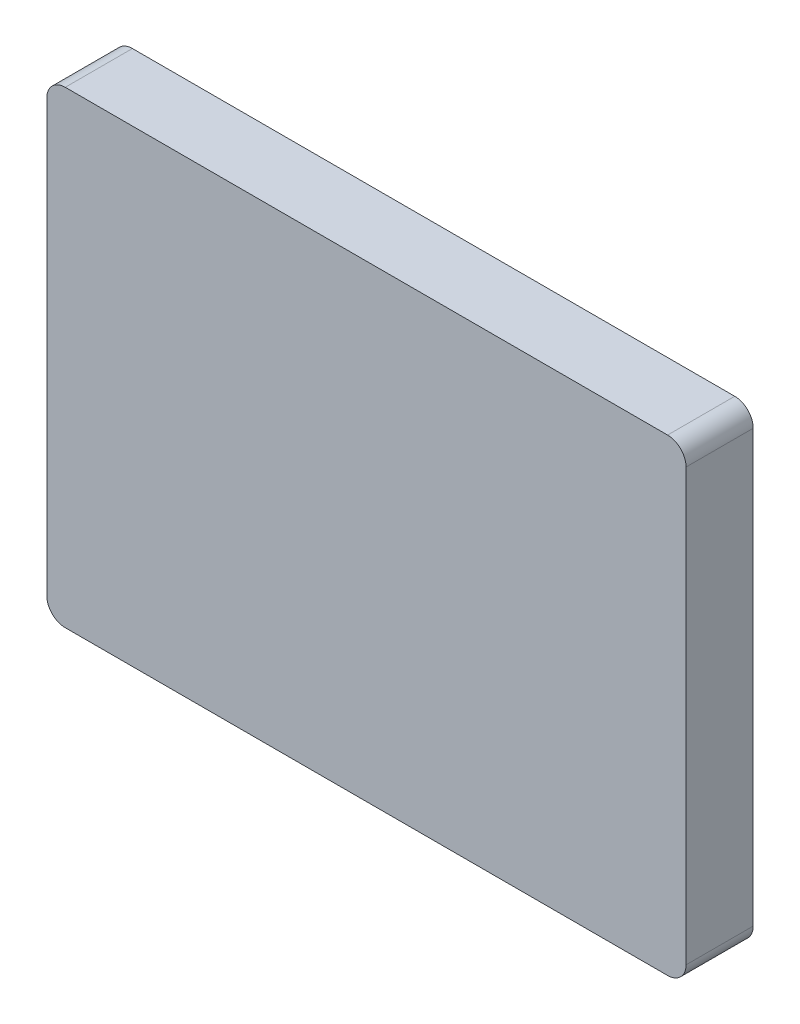
ISO-10303-21;
HEADER;
FILE_DESCRIPTION(('STEP AP214'),'2;1');
FILE_NAME('part.step','',(''),(''),'','','');
FILE_SCHEMA(('AUTOMOTIVE_DESIGN { 1 0 10303 214 1 1 1 1 }'));
ENDSEC;
DATA;
#1=APPLICATION_CONTEXT('core data for automotive mechanical design processes');
#2=APPLICATION_PROTOCOL_DEFINITION('international standard','automotive_design',2000,#1);
#3=PRODUCT_CONTEXT('',#1,'mechanical');
#4=PRODUCT('Part','Part','',(#3));
#5=PRODUCT_RELATED_PRODUCT_CATEGORY('part','',(#4));
#6=PRODUCT_DEFINITION_FORMATION('','',#4);
#7=PRODUCT_DEFINITION_CONTEXT('part definition',#1,'design');
#8=PRODUCT_DEFINITION('design','',#6,#7);
#9=PRODUCT_DEFINITION_SHAPE('','',#8);
#10=(LENGTH_UNIT() NAMED_UNIT(*) SI_UNIT(.MILLI.,.METRE.));
#11=(NAMED_UNIT(*) PLANE_ANGLE_UNIT() SI_UNIT($,.RADIAN.));
#12=(NAMED_UNIT(*) SI_UNIT($,.STERADIAN.) SOLID_ANGLE_UNIT());
#13=UNCERTAINTY_MEASURE_WITH_UNIT(LENGTH_MEASURE(1.E-05),#10,'distance_accuracy_value','');
#14=(GEOMETRIC_REPRESENTATION_CONTEXT(3) GLOBAL_UNCERTAINTY_ASSIGNED_CONTEXT((#13)) GLOBAL_UNIT_ASSIGNED_CONTEXT((#10,
#11,#12)) REPRESENTATION_CONTEXT('',''));
#15=CARTESIAN_POINT('',(0.,0.,0.));
#16=DIRECTION('',(0.,0.,1.));
#17=DIRECTION('',(1.,0.,0.));
#18=AXIS2_PLACEMENT_3D('',#15,#16,#17);
#19=CARTESIAN_POINT('',(44.85,32.2765542250174,10.));
#20=DIRECTION('',(0.,0.,-1.));
#21=DIRECTION('',(-1.,0.,0.));
#22=AXIS2_PLACEMENT_3D('',#19,#20,#21);
#23=CYLINDRICAL_SURFACE('',#22,2.74999999997698);
#24=CARTESIAN_POINT('',(44.85,32.2765542250174,0.));
#25=DIRECTION('',(0.,0.,1.));
#26=DIRECTION('',(1.,0.,0.));
#27=AXIS2_PLACEMENT_3D('',#24,#25,#26);
#28=CIRCLE('',#27,2.74999999997698);
#29=CARTESIAN_POINT('',(47.599999999977,32.2765542250174,0.));
#30=VERTEX_POINT('',#29);
#31=CARTESIAN_POINT('',(44.85,35.0265542249944,0.));
#32=VERTEX_POINT('',#31);
#33=EDGE_CURVE('E146',#30,#32,#28,.T.);
#34=ORIENTED_EDGE('',*,*,#33,.T.);
#35=DIRECTION('',(0.,0.,-1.));
#36=VECTOR('',#35,1.);
#37=CARTESIAN_POINT('',(44.85,35.0265542249944,10.));
#38=LINE('',#37,#36);
#39=CARTESIAN_POINT('',(44.85,35.0265542249944,10.));
#40=VERTEX_POINT('',#39);
#41=EDGE_CURVE('E11',#40,#32,#38,.T.);
#42=ORIENTED_EDGE('',*,*,#41,.F.);
#43=CARTESIAN_POINT('',(44.85,32.2765542250174,10.));
#44=DIRECTION('',(0.,0.,1.));
#45=DIRECTION('',(1.,0.,0.));
#46=AXIS2_PLACEMENT_3D('',#43,#44,#45);
#47=CIRCLE('',#46,2.74999999997698);
#48=CARTESIAN_POINT('',(47.599999999977,32.2765542250174,10.));
#49=VERTEX_POINT('',#48);
#50=EDGE_CURVE('E168',#49,#40,#47,.T.);
#51=ORIENTED_EDGE('',*,*,#50,.F.);
#52=DIRECTION('',(0.,0.,-1.));
#53=VECTOR('',#52,1.);
#54=CARTESIAN_POINT('',(47.599999999977,32.2765542250174,10.));
#55=LINE('',#54,#53);
#56=EDGE_CURVE('E142',#49,#30,#55,.T.);
#57=ORIENTED_EDGE('',*,*,#56,.T.);
#58=EDGE_LOOP('',(#34,#42,#51,#57));
#59=FACE_BOUND('',#58,.T.);
#60=ADVANCED_FACE('F45',(#59),#23,.T.);
#61=CARTESIAN_POINT('',(44.85,35.0265542249944,10.));
#62=DIRECTION('',(0.,-1.,0.));
#63=DIRECTION('',(0.,0.,-1.));
#64=AXIS2_PLACEMENT_3D('',#61,#62,#63);
#65=PLANE('',#64);
#66=DIRECTION('',(-1.,0.,0.));
#67=VECTOR('',#66,1.);
#68=CARTESIAN_POINT('',(44.85,35.0265542249944,0.));
#69=LINE('',#68,#67);
#70=CARTESIAN_POINT('',(-44.85,35.0265542249944,0.));
#71=VERTEX_POINT('',#70);
#72=EDGE_CURVE('E150',#32,#71,#69,.T.);
#73=ORIENTED_EDGE('',*,*,#72,.T.);
#74=DIRECTION('',(0.,0.,-1.));
#75=VECTOR('',#74,1.);
#76=CARTESIAN_POINT('',(-44.85,35.0265542249944,10.));
#77=LINE('',#76,#75);
#78=CARTESIAN_POINT('',(-44.85,35.0265542249944,10.));
#79=VERTEX_POINT('',#78);
#80=EDGE_CURVE('E54',#79,#71,#77,.T.);
#81=ORIENTED_EDGE('',*,*,#80,.F.);
#82=DIRECTION('',(-1.,0.,0.));
#83=VECTOR('',#82,1.);
#84=CARTESIAN_POINT('',(44.85,35.0265542249944,10.));
#85=LINE('',#84,#83);
#86=EDGE_CURVE('E105',#40,#79,#85,.T.);
#87=ORIENTED_EDGE('',*,*,#86,.F.);
#88=ORIENTED_EDGE('',*,*,#41,.T.);
#89=EDGE_LOOP('',(#73,#81,#87,#88));
#90=FACE_BOUND('',#89,.T.);
#91=ADVANCED_FACE('F214',(#90),#65,.F.);
#92=CARTESIAN_POINT('',(-44.85,32.2765542250174,10.));
#93=DIRECTION('',(0.,0.,-1.));
#94=DIRECTION('',(-1.,0.,0.));
#95=AXIS2_PLACEMENT_3D('',#92,#93,#94);
#96=CYLINDRICAL_SURFACE('',#95,2.74999999997698);
#97=CARTESIAN_POINT('',(-44.85,32.2765542250174,0.));
#98=DIRECTION('',(0.,0.,1.));
#99=DIRECTION('',(1.,0.,0.));
#100=AXIS2_PLACEMENT_3D('',#97,#98,#99);
#101=CIRCLE('',#100,2.74999999997698);
#102=CARTESIAN_POINT('',(-47.599999999977,32.2765542250174,0.));
#103=VERTEX_POINT('',#102);
#104=EDGE_CURVE('E153',#71,#103,#101,.T.);
#105=ORIENTED_EDGE('',*,*,#104,.T.);
#106=DIRECTION('',(0.,0.,-1.));
#107=VECTOR('',#106,1.);
#108=CARTESIAN_POINT('',(-47.599999999977,32.2765542250174,10.));
#109=LINE('',#108,#107);
#110=CARTESIAN_POINT('',(-47.599999999977,32.2765542250174,10.));
#111=VERTEX_POINT('',#110);
#112=EDGE_CURVE('E179',#111,#103,#109,.T.);
#113=ORIENTED_EDGE('',*,*,#112,.F.);
#114=CARTESIAN_POINT('',(-44.85,32.2765542250174,10.));
#115=DIRECTION('',(0.,0.,1.));
#116=DIRECTION('',(1.,0.,0.));
#117=AXIS2_PLACEMENT_3D('',#114,#115,#116);
#118=CIRCLE('',#117,2.74999999997698);
#119=EDGE_CURVE('E189',#79,#111,#118,.T.);
#120=ORIENTED_EDGE('',*,*,#119,.F.);
#121=ORIENTED_EDGE('',*,*,#80,.T.);
#122=EDGE_LOOP('',(#105,#113,#120,#121));
#123=FACE_BOUND('',#122,.T.);
#124=ADVANCED_FACE('F187',(#123),#96,.T.);
#125=CARTESIAN_POINT('',(-47.599999999977,32.2765542250174,10.));
#126=DIRECTION('',(1.,0.,0.));
#127=DIRECTION('',(0.,0.,-1.));
#128=AXIS2_PLACEMENT_3D('',#125,#126,#127);
#129=PLANE('',#128);
#130=DIRECTION('',(0.,-1.,0.));
#131=VECTOR('',#130,1.);
#132=CARTESIAN_POINT('',(-47.599999999977,32.2765542250174,0.));
#133=LINE('',#132,#131);
#134=CARTESIAN_POINT('',(-47.599999999977,-31.9234457749826,0.));
#135=VERTEX_POINT('',#134);
#136=EDGE_CURVE('E156',#103,#135,#133,.T.);
#137=ORIENTED_EDGE('',*,*,#136,.T.);
#138=DIRECTION('',(0.,0.,-1.));
#139=VECTOR('',#138,1.);
#140=CARTESIAN_POINT('',(-47.599999999977,-31.9234457749826,10.));
#141=LINE('',#140,#139);
#142=CARTESIAN_POINT('',(-47.599999999977,-31.9234457749826,10.));
#143=VERTEX_POINT('',#142);
#144=EDGE_CURVE('E175',#143,#135,#141,.T.);
#145=ORIENTED_EDGE('',*,*,#144,.F.);
#146=DIRECTION('',(0.,-1.,0.));
#147=VECTOR('',#146,1.);
#148=CARTESIAN_POINT('',(-47.599999999977,32.2765542250174,10.));
#149=LINE('',#148,#147);
#150=EDGE_CURVE('E202',#111,#143,#149,.T.);
#151=ORIENTED_EDGE('',*,*,#150,.F.);
#152=ORIENTED_EDGE('',*,*,#112,.T.);
#153=EDGE_LOOP('',(#137,#145,#151,#152));
#154=FACE_BOUND('',#153,.T.);
#155=ADVANCED_FACE('F197',(#154),#129,.F.);
#156=CARTESIAN_POINT('',(-44.85,-31.9234457749826,10.));
#157=DIRECTION('',(0.,0.,-1.));
#158=DIRECTION('',(-1.,0.,0.));
#159=AXIS2_PLACEMENT_3D('',#156,#157,#158);
#160=CYLINDRICAL_SURFACE('',#159,2.74999999997698);
#161=CARTESIAN_POINT('',(-44.85,-31.9234457749826,0.));
#162=DIRECTION('',(0.,0.,1.));
#163=DIRECTION('',(1.,0.,0.));
#164=AXIS2_PLACEMENT_3D('',#161,#162,#163);
#165=CIRCLE('',#164,2.74999999997698);
#166=CARTESIAN_POINT('',(-44.85,-34.6734457749596,0.));
#167=VERTEX_POINT('',#166);
#168=EDGE_CURVE('E159',#135,#167,#165,.T.);
#169=ORIENTED_EDGE('',*,*,#168,.T.);
#170=DIRECTION('',(0.,0.,-1.));
#171=VECTOR('',#170,1.);
#172=CARTESIAN_POINT('',(-44.85,-34.6734457749596,10.));
#173=LINE('',#172,#171);
#174=CARTESIAN_POINT('',(-44.85,-34.6734457749596,10.));
#175=VERTEX_POINT('',#174);
#176=EDGE_CURVE('E135',#175,#167,#173,.T.);
#177=ORIENTED_EDGE('',*,*,#176,.F.);
#178=CARTESIAN_POINT('',(-44.85,-31.9234457749826,10.));
#179=DIRECTION('',(0.,0.,1.));
#180=DIRECTION('',(1.,0.,0.));
#181=AXIS2_PLACEMENT_3D('',#178,#179,#180);
#182=CIRCLE('',#181,2.74999999997698);
#183=EDGE_CURVE('E124',#143,#175,#182,.T.);
#184=ORIENTED_EDGE('',*,*,#183,.F.);
#185=ORIENTED_EDGE('',*,*,#144,.T.);
#186=EDGE_LOOP('',(#169,#177,#184,#185));
#187=FACE_BOUND('',#186,.T.);
#188=ADVANCED_FACE('F200',(#187),#160,.T.);
#189=CARTESIAN_POINT('',(-44.85,-34.6734457749596,10.));
#190=DIRECTION('',(0.,1.,0.));
#191=DIRECTION('',(0.,0.,1.));
#192=AXIS2_PLACEMENT_3D('',#189,#190,#191);
#193=PLANE('',#192);
#194=DIRECTION('',(1.,0.,0.));
#195=VECTOR('',#194,1.);
#196=CARTESIAN_POINT('',(-44.85,-34.6734457749596,0.));
#197=LINE('',#196,#195);
#198=CARTESIAN_POINT('',(44.85,-34.6734457749596,0.));
#199=VERTEX_POINT('',#198);
#200=EDGE_CURVE('E133',#167,#199,#197,.T.);
#201=ORIENTED_EDGE('',*,*,#200,.T.);
#202=DIRECTION('',(0.,0.,-1.));
#203=VECTOR('',#202,1.);
#204=CARTESIAN_POINT('',(44.85,-34.6734457749596,10.));
#205=LINE('',#204,#203);
#206=CARTESIAN_POINT('',(44.85,-34.6734457749596,10.));
#207=VERTEX_POINT('',#206);
#208=EDGE_CURVE('E130',#207,#199,#205,.T.);
#209=ORIENTED_EDGE('',*,*,#208,.F.);
#210=DIRECTION('',(1.,0.,0.));
#211=VECTOR('',#210,1.);
#212=CARTESIAN_POINT('',(-44.85,-34.6734457749596,10.));
#213=LINE('',#212,#211);
#214=EDGE_CURVE('E118',#175,#207,#213,.T.);
#215=ORIENTED_EDGE('',*,*,#214,.F.);
#216=ORIENTED_EDGE('',*,*,#176,.T.);
#217=EDGE_LOOP('',(#201,#209,#215,#216));
#218=FACE_BOUND('',#217,.T.);
#219=ADVANCED_FACE('F131',(#218),#193,.F.);
#220=CARTESIAN_POINT('',(44.85,-31.9234457749826,10.));
#221=DIRECTION('',(0.,0.,-1.));
#222=DIRECTION('',(-1.,0.,0.));
#223=AXIS2_PLACEMENT_3D('',#220,#221,#222);
#224=CYLINDRICAL_SURFACE('',#223,2.74999999997698);
#225=CARTESIAN_POINT('',(44.85,-31.9234457749826,0.));
#226=DIRECTION('',(0.,0.,1.));
#227=DIRECTION('',(1.,0.,0.));
#228=AXIS2_PLACEMENT_3D('',#225,#226,#227);
#229=CIRCLE('',#228,2.74999999997698);
#230=CARTESIAN_POINT('',(47.599999999977,-31.9234457749826,0.));
#231=VERTEX_POINT('',#230);
#232=EDGE_CURVE('E91',#199,#231,#229,.T.);
#233=ORIENTED_EDGE('',*,*,#232,.T.);
#234=DIRECTION('',(0.,0.,-1.));
#235=VECTOR('',#234,1.);
#236=CARTESIAN_POINT('',(47.599999999977,-31.9234457749826,10.));
#237=LINE('',#236,#235);
#238=CARTESIAN_POINT('',(47.599999999977,-31.9234457749826,10.));
#239=VERTEX_POINT('',#238);
#240=EDGE_CURVE('E136',#239,#231,#237,.T.);
#241=ORIENTED_EDGE('',*,*,#240,.F.);
#242=CARTESIAN_POINT('',(44.85,-31.9234457749826,10.));
#243=DIRECTION('',(0.,0.,1.));
#244=DIRECTION('',(1.,0.,0.));
#245=AXIS2_PLACEMENT_3D('',#242,#243,#244);
#246=CIRCLE('',#245,2.74999999997698);
#247=EDGE_CURVE('E122',#207,#239,#246,.T.);
#248=ORIENTED_EDGE('',*,*,#247,.F.);
#249=ORIENTED_EDGE('',*,*,#208,.T.);
#250=EDGE_LOOP('',(#233,#241,#248,#249));
#251=FACE_BOUND('',#250,.T.);
#252=ADVANCED_FACE('F138',(#251),#224,.T.);
#253=CARTESIAN_POINT('',(47.599999999977,32.2765542250174,10.));
#254=DIRECTION('',(-1.,0.,0.));
#255=DIRECTION('',(0.,0.,1.));
#256=AXIS2_PLACEMENT_3D('',#253,#254,#255);
#257=PLANE('',#256);
#258=DIRECTION('',(0.,1.,0.));
#259=VECTOR('',#258,1.);
#260=CARTESIAN_POINT('',(47.599999999977,32.2765542250174,0.));
#261=LINE('',#260,#259);
#262=EDGE_CURVE('E97',#231,#30,#261,.T.);
#263=ORIENTED_EDGE('',*,*,#262,.T.);
#264=ORIENTED_EDGE('',*,*,#56,.F.);
#265=DIRECTION('',(0.,1.,0.));
#266=VECTOR('',#265,1.);
#267=CARTESIAN_POINT('',(47.599999999977,32.2765542250174,10.));
#268=LINE('',#267,#266);
#269=EDGE_CURVE('E62',#239,#49,#268,.T.);
#270=ORIENTED_EDGE('',*,*,#269,.F.);
#271=ORIENTED_EDGE('',*,*,#240,.T.);
#272=EDGE_LOOP('',(#263,#264,#270,#271));
#273=FACE_BOUND('',#272,.T.);
#274=ADVANCED_FACE('F230',(#273),#257,.F.);
#275=CARTESIAN_POINT('',(44.85,32.2765542250174,10.));
#276=DIRECTION('',(0.,0.,1.));
#277=DIRECTION('',(1.,0.,0.));
#278=AXIS2_PLACEMENT_3D('',#275,#276,#277);
#279=PLANE('',#278);
#280=ORIENTED_EDGE('',*,*,#50,.T.);
#281=ORIENTED_EDGE('',*,*,#86,.T.);
#282=ORIENTED_EDGE('',*,*,#119,.T.);
#283=ORIENTED_EDGE('',*,*,#150,.T.);
#284=ORIENTED_EDGE('',*,*,#183,.T.);
#285=ORIENTED_EDGE('',*,*,#214,.T.);
#286=ORIENTED_EDGE('',*,*,#247,.T.);
#287=ORIENTED_EDGE('',*,*,#269,.T.);
#288=EDGE_LOOP('',(#280,#281,#282,#283,#284,#285,#286,#287));
#289=FACE_BOUND('',#288,.T.);
#290=ADVANCED_FACE('F120',(#289),#279,.T.);
#291=CARTESIAN_POINT('',(44.85,32.2765542250174,0.));
#292=DIRECTION('',(0.,0.,1.));
#293=DIRECTION('',(1.,0.,0.));
#294=AXIS2_PLACEMENT_3D('',#291,#292,#293);
#295=PLANE('',#294);
#296=ORIENTED_EDGE('',*,*,#33,.F.);
#297=ORIENTED_EDGE('',*,*,#262,.F.);
#298=ORIENTED_EDGE('',*,*,#232,.F.);
#299=ORIENTED_EDGE('',*,*,#200,.F.);
#300=ORIENTED_EDGE('',*,*,#168,.F.);
#301=ORIENTED_EDGE('',*,*,#136,.F.);
#302=ORIENTED_EDGE('',*,*,#104,.F.);
#303=ORIENTED_EDGE('',*,*,#72,.F.);
#304=EDGE_LOOP('',(#296,#297,#298,#299,#300,#301,#302,#303));
#305=FACE_BOUND('',#304,.T.);
#306=ADVANCED_FACE('F193',(#305),#295,.F.);
#307=CLOSED_SHELL('',(#60,#91,#124,#155,#188,#219,#252,#274,#290,#306));
#308=MANIFOLD_SOLID_BREP('B2',#307);
#309=ADVANCED_BREP_SHAPE_REPRESENTATION('',(#18,#308),#14);
#310=SHAPE_DEFINITION_REPRESENTATION(#9,#309);
ENDSEC;
END-ISO-10303-21;
